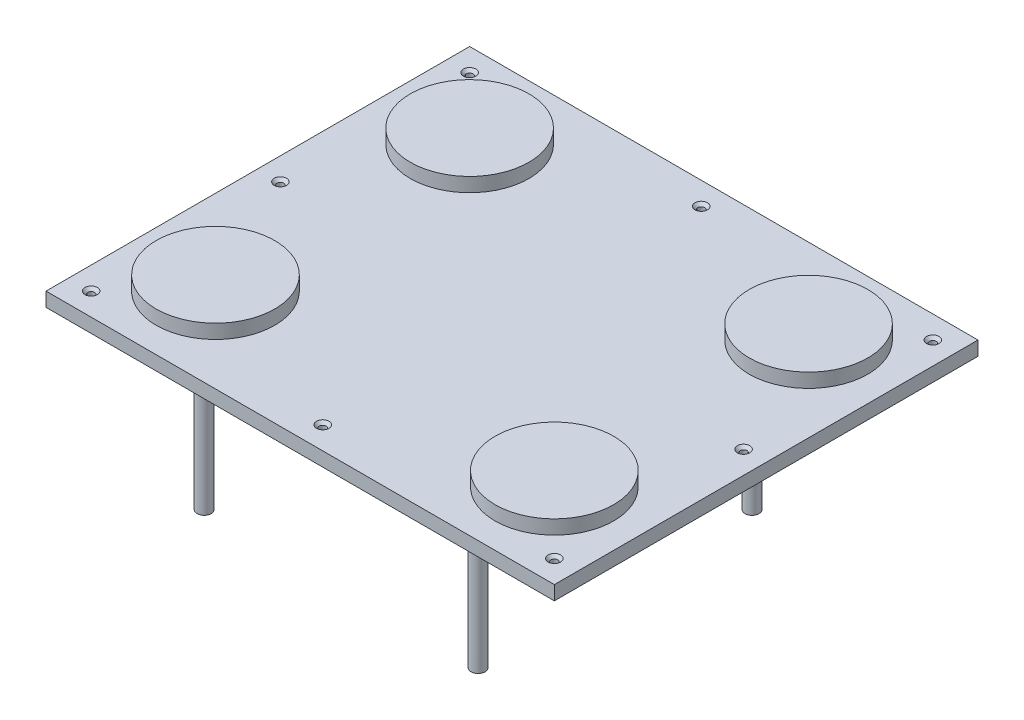
ISO-10303-21;
HEADER;
FILE_DESCRIPTION(('STEP AP214'),'2;1');
FILE_NAME('part.step','',(''),(''),'','','');
FILE_SCHEMA(('AUTOMOTIVE_DESIGN { 1 0 10303 214 1 1 1 1 }'));
ENDSEC;
DATA;
#1=APPLICATION_CONTEXT('core data for automotive mechanical design processes');
#2=APPLICATION_PROTOCOL_DEFINITION('international standard','automotive_design',2000,#1);
#3=PRODUCT_CONTEXT('',#1,'mechanical');
#4=PRODUCT('Part','Part','',(#3));
#5=PRODUCT_RELATED_PRODUCT_CATEGORY('part','',(#4));
#6=PRODUCT_DEFINITION_FORMATION('','',#4);
#7=PRODUCT_DEFINITION_CONTEXT('part definition',#1,'design');
#8=PRODUCT_DEFINITION('design','',#6,#7);
#9=PRODUCT_DEFINITION_SHAPE('','',#8);
#10=(LENGTH_UNIT() NAMED_UNIT(*) SI_UNIT(.MILLI.,.METRE.));
#11=(NAMED_UNIT(*) PLANE_ANGLE_UNIT() SI_UNIT($,.RADIAN.));
#12=(NAMED_UNIT(*) SI_UNIT($,.STERADIAN.) SOLID_ANGLE_UNIT());
#13=UNCERTAINTY_MEASURE_WITH_UNIT(LENGTH_MEASURE(1.E-05),#10,'distance_accuracy_value','');
#14=(GEOMETRIC_REPRESENTATION_CONTEXT(3) GLOBAL_UNCERTAINTY_ASSIGNED_CONTEXT((#13)) GLOBAL_UNIT_ASSIGNED_CONTEXT((#10,
#11,#12)) REPRESENTATION_CONTEXT('',''));
#15=CARTESIAN_POINT('',(0.,0.,0.));
#16=DIRECTION('',(0.,0.,1.));
#17=DIRECTION('',(1.,0.,0.));
#18=AXIS2_PLACEMENT_3D('',#15,#16,#17);
#19=CARTESIAN_POINT('',(90.,5.,-75.));
#20=DIRECTION('',(-1.,0.,0.));
#21=DIRECTION('',(0.,0.,1.));
#22=AXIS2_PLACEMENT_3D('',#19,#20,#21);
#23=PLANE('',#22);
#24=DIRECTION('',(0.,0.,-1.));
#25=VECTOR('',#24,1.);
#26=CARTESIAN_POINT('',(90.,0.,-75.));
#27=LINE('',#26,#25);
#28=CARTESIAN_POINT('',(90.,0.,75.));
#29=VERTEX_POINT('',#28);
#30=CARTESIAN_POINT('',(90.,0.,-75.));
#31=VERTEX_POINT('',#30);
#32=EDGE_CURVE('E279',#29,#31,#27,.T.);
#33=ORIENTED_EDGE('',*,*,#32,.T.);
#34=DIRECTION('',(0.,-1.,0.));
#35=VECTOR('',#34,1.);
#36=CARTESIAN_POINT('',(90.,5.,-75.));
#37=LINE('',#36,#35);
#38=CARTESIAN_POINT('',(90.,5.,-75.));
#39=VERTEX_POINT('',#38);
#40=EDGE_CURVE('E309',#39,#31,#37,.T.);
#41=ORIENTED_EDGE('',*,*,#40,.F.);
#42=DIRECTION('',(0.,0.,-1.));
#43=VECTOR('',#42,1.);
#44=CARTESIAN_POINT('',(90.,5.,-75.));
#45=LINE('',#44,#43);
#46=CARTESIAN_POINT('',(90.,5.,75.));
#47=VERTEX_POINT('',#46);
#48=EDGE_CURVE('E280',#47,#39,#45,.T.);
#49=ORIENTED_EDGE('',*,*,#48,.F.);
#50=DIRECTION('',(0.,-1.,0.));
#51=VECTOR('',#50,1.);
#52=CARTESIAN_POINT('',(90.,5.,75.));
#53=LINE('',#52,#51);
#54=EDGE_CURVE('E290',#47,#29,#53,.T.);
#55=ORIENTED_EDGE('',*,*,#54,.T.);
#56=EDGE_LOOP('',(#33,#41,#49,#55));
#57=FACE_BOUND('',#56,.T.);
#58=ADVANCED_FACE('F38',(#57),#23,.F.);
#59=CARTESIAN_POINT('',(-90.,5.,-75.));
#60=DIRECTION('',(0.,0.,1.));
#61=DIRECTION('',(1.,0.,0.));
#62=AXIS2_PLACEMENT_3D('',#59,#60,#61);
#63=PLANE('',#62);
#64=DIRECTION('',(-1.,0.,0.));
#65=VECTOR('',#64,1.);
#66=CARTESIAN_POINT('',(-90.,0.,-75.));
#67=LINE('',#66,#65);
#68=CARTESIAN_POINT('',(-90.,0.,-75.));
#69=VERTEX_POINT('',#68);
#70=EDGE_CURVE('E294',#31,#69,#67,.T.);
#71=ORIENTED_EDGE('',*,*,#70,.T.);
#72=DIRECTION('',(0.,-1.,0.));
#73=VECTOR('',#72,1.);
#74=CARTESIAN_POINT('',(-90.,5.,-75.));
#75=LINE('',#74,#73);
#76=CARTESIAN_POINT('',(-90.,5.,-75.));
#77=VERTEX_POINT('',#76);
#78=EDGE_CURVE('E306',#77,#69,#75,.T.);
#79=ORIENTED_EDGE('',*,*,#78,.F.);
#80=DIRECTION('',(-1.,0.,0.));
#81=VECTOR('',#80,1.);
#82=CARTESIAN_POINT('',(-90.,5.,-75.));
#83=LINE('',#82,#81);
#84=EDGE_CURVE('E88',#39,#77,#83,.T.);
#85=ORIENTED_EDGE('',*,*,#84,.F.);
#86=ORIENTED_EDGE('',*,*,#40,.T.);
#87=EDGE_LOOP('',(#71,#79,#85,#86));
#88=FACE_BOUND('',#87,.T.);
#89=ADVANCED_FACE('F360',(#88),#63,.F.);
#90=CARTESIAN_POINT('',(-90.,5.,-75.));
#91=DIRECTION('',(1.,0.,0.));
#92=DIRECTION('',(0.,0.,-1.));
#93=AXIS2_PLACEMENT_3D('',#90,#91,#92);
#94=PLANE('',#93);
#95=DIRECTION('',(0.,0.,1.));
#96=VECTOR('',#95,1.);
#97=CARTESIAN_POINT('',(-90.,0.,-75.));
#98=LINE('',#97,#96);
#99=CARTESIAN_POINT('',(-90.,0.,75.));
#100=VERTEX_POINT('',#99);
#101=EDGE_CURVE('E74',#69,#100,#98,.T.);
#102=ORIENTED_EDGE('',*,*,#101,.T.);
#103=DIRECTION('',(0.,-1.,0.));
#104=VECTOR('',#103,1.);
#105=CARTESIAN_POINT('',(-90.,5.,75.));
#106=LINE('',#105,#104);
#107=CARTESIAN_POINT('',(-90.,5.,75.));
#108=VERTEX_POINT('',#107);
#109=EDGE_CURVE('E303',#108,#100,#106,.T.);
#110=ORIENTED_EDGE('',*,*,#109,.F.);
#111=DIRECTION('',(0.,0.,1.));
#112=VECTOR('',#111,1.);
#113=CARTESIAN_POINT('',(-90.,5.,-75.));
#114=LINE('',#113,#112);
#115=EDGE_CURVE('E285',#77,#108,#114,.T.);
#116=ORIENTED_EDGE('',*,*,#115,.F.);
#117=ORIENTED_EDGE('',*,*,#78,.T.);
#118=EDGE_LOOP('',(#102,#110,#116,#117));
#119=FACE_BOUND('',#118,.T.);
#120=ADVANCED_FACE('F359',(#119),#94,.F.);
#121=CARTESIAN_POINT('',(-90.,5.,75.));
#122=DIRECTION('',(0.,0.,-1.));
#123=DIRECTION('',(-1.,0.,0.));
#124=AXIS2_PLACEMENT_3D('',#121,#122,#123);
#125=PLANE('',#124);
#126=DIRECTION('',(1.,0.,0.));
#127=VECTOR('',#126,1.);
#128=CARTESIAN_POINT('',(-90.,0.,75.));
#129=LINE('',#128,#127);
#130=EDGE_CURVE('E80',#100,#29,#129,.T.);
#131=ORIENTED_EDGE('',*,*,#130,.T.);
#132=ORIENTED_EDGE('',*,*,#54,.F.);
#133=DIRECTION('',(1.,0.,0.));
#134=VECTOR('',#133,1.);
#135=CARTESIAN_POINT('',(-90.,5.,75.));
#136=LINE('',#135,#134);
#137=EDGE_CURVE('E56',#108,#47,#136,.T.);
#138=ORIENTED_EDGE('',*,*,#137,.F.);
#139=ORIENTED_EDGE('',*,*,#109,.T.);
#140=EDGE_LOOP('',(#131,#132,#138,#139));
#141=FACE_BOUND('',#140,.T.);
#142=ADVANCED_FACE('F357',(#141),#125,.F.);
#143=CARTESIAN_POINT('',(0.,5.,0.));
#144=DIRECTION('',(0.,1.,0.));
#145=DIRECTION('',(0.,0.,1.));
#146=AXIS2_PLACEMENT_3D('',#143,#144,#145);
#147=PLANE('',#146);
#148=CARTESIAN_POINT('',(37.,5.,49.));
#149=DIRECTION('',(0.,1.,0.));
#150=DIRECTION('',(0.,0.,1.));
#151=AXIS2_PLACEMENT_3D('',#148,#149,#150);
#152=CIRCLE('',#151,0.499999999999987);
#153=CARTESIAN_POINT('',(37.,5.,49.5));
#154=VERTEX_POINT('',#153);
#155=EDGE_CURVE('E41',#154,#154,#152,.T.);
#156=ORIENTED_EDGE('',*,*,#155,.F.);
#157=EDGE_LOOP('',(#156));
#158=FACE_BOUND('',#157,.T.);
#159=CARTESIAN_POINT('',(60.,5.,45.));
#160=DIRECTION('',(0.,1.,0.));
#161=DIRECTION('',(0.,0.,1.));
#162=AXIS2_PLACEMENT_3D('',#159,#160,#161);
#163=CIRCLE('',#162,21.);
#164=CARTESIAN_POINT('',(60.,5.,66.));
#165=VERTEX_POINT('',#164);
#166=EDGE_CURVE('E151',#165,#165,#163,.T.);
#167=ORIENTED_EDGE('',*,*,#166,.F.);
#168=EDGE_LOOP('',(#167));
#169=FACE_BOUND('',#168,.T.);
#170=CARTESIAN_POINT('',(60.,5.,-45.));
#171=DIRECTION('',(0.,1.,0.));
#172=DIRECTION('',(0.,0.,1.));
#173=AXIS2_PLACEMENT_3D('',#170,#171,#172);
#174=CIRCLE('',#173,21.);
#175=CARTESIAN_POINT('',(60.,5.,-24.));
#176=VERTEX_POINT('',#175);
#177=EDGE_CURVE('E156',#176,#176,#174,.T.);
#178=ORIENTED_EDGE('',*,*,#177,.F.);
#179=EDGE_LOOP('',(#178));
#180=FACE_BOUND('',#179,.T.);
#181=CARTESIAN_POINT('',(-60.,5.,-45.));
#182=DIRECTION('',(0.,1.,0.));
#183=DIRECTION('',(0.,0.,1.));
#184=AXIS2_PLACEMENT_3D('',#181,#182,#183);
#185=CIRCLE('',#184,21.);
#186=CARTESIAN_POINT('',(-60.,5.,-24.));
#187=VERTEX_POINT('',#186);
#188=EDGE_CURVE('E164',#187,#187,#185,.T.);
#189=ORIENTED_EDGE('',*,*,#188,.F.);
#190=EDGE_LOOP('',(#189));
#191=FACE_BOUND('',#190,.T.);
#192=CARTESIAN_POINT('',(-60.,5.,45.));
#193=DIRECTION('',(0.,1.,0.));
#194=DIRECTION('',(0.,0.,1.));
#195=AXIS2_PLACEMENT_3D('',#192,#193,#194);
#196=CIRCLE('',#195,21.);
#197=CARTESIAN_POINT('',(-60.,5.,66.));
#198=VERTEX_POINT('',#197);
#199=EDGE_CURVE('E172',#198,#198,#196,.T.);
#200=ORIENTED_EDGE('',*,*,#199,.F.);
#201=EDGE_LOOP('',(#200));
#202=FACE_BOUND('',#201,.T.);
#203=CARTESIAN_POINT('',(-82.,5.,-67.));
#204=DIRECTION('',(0.,1.,0.));
#205=DIRECTION('',(0.,0.,1.));
#206=AXIS2_PLACEMENT_3D('',#203,#204,#205);
#207=CIRCLE('',#206,2.20000000000001);
#208=CARTESIAN_POINT('',(-82.,5.,-64.8));
#209=VERTEX_POINT('',#208);
#210=EDGE_CURVE('E180',#209,#209,#207,.T.);
#211=ORIENTED_EDGE('',*,*,#210,.F.);
#212=EDGE_LOOP('',(#211));
#213=FACE_BOUND('',#212,.T.);
#214=CARTESIAN_POINT('',(-82.,5.,0.));
#215=DIRECTION('',(0.,1.,0.));
#216=DIRECTION('',(0.,0.,1.));
#217=AXIS2_PLACEMENT_3D('',#214,#215,#216);
#218=CIRCLE('',#217,2.20000000000001);
#219=CARTESIAN_POINT('',(-82.,5.,2.20000000000001));
#220=VERTEX_POINT('',#219);
#221=EDGE_CURVE('E195',#220,#220,#218,.T.);
#222=ORIENTED_EDGE('',*,*,#221,.F.);
#223=EDGE_LOOP('',(#222));
#224=FACE_BOUND('',#223,.T.);
#225=CARTESIAN_POINT('',(-82.,5.,67.));
#226=DIRECTION('',(0.,1.,0.));
#227=DIRECTION('',(0.,0.,1.));
#228=AXIS2_PLACEMENT_3D('',#225,#226,#227);
#229=CIRCLE('',#228,2.20000000000001);
#230=CARTESIAN_POINT('',(-82.,5.,69.2));
#231=VERTEX_POINT('',#230);
#232=EDGE_CURVE('E207',#231,#231,#229,.T.);
#233=ORIENTED_EDGE('',*,*,#232,.F.);
#234=EDGE_LOOP('',(#233));
#235=FACE_BOUND('',#234,.T.);
#236=CARTESIAN_POINT('',(0.,5.,67.));
#237=DIRECTION('',(0.,1.,0.));
#238=DIRECTION('',(0.,0.,1.));
#239=AXIS2_PLACEMENT_3D('',#236,#237,#238);
#240=CIRCLE('',#239,2.2);
#241=CARTESIAN_POINT('',(0.,5.,69.2));
#242=VERTEX_POINT('',#241);
#243=EDGE_CURVE('E219',#242,#242,#240,.T.);
#244=ORIENTED_EDGE('',*,*,#243,.F.);
#245=EDGE_LOOP('',(#244));
#246=FACE_BOUND('',#245,.T.);
#247=CARTESIAN_POINT('',(82.,5.,67.));
#248=DIRECTION('',(0.,1.,0.));
#249=DIRECTION('',(0.,0.,1.));
#250=AXIS2_PLACEMENT_3D('',#247,#248,#249);
#251=CIRCLE('',#250,2.20000000000001);
#252=CARTESIAN_POINT('',(82.,5.,69.2));
#253=VERTEX_POINT('',#252);
#254=EDGE_CURVE('E231',#253,#253,#251,.T.);
#255=ORIENTED_EDGE('',*,*,#254,.F.);
#256=EDGE_LOOP('',(#255));
#257=FACE_BOUND('',#256,.T.);
#258=CARTESIAN_POINT('',(82.,5.,0.));
#259=DIRECTION('',(0.,1.,0.));
#260=DIRECTION('',(0.,0.,1.));
#261=AXIS2_PLACEMENT_3D('',#258,#259,#260);
#262=CIRCLE('',#261,2.20000000000001);
#263=CARTESIAN_POINT('',(82.,5.,2.20000000000001));
#264=VERTEX_POINT('',#263);
#265=EDGE_CURVE('E243',#264,#264,#262,.T.);
#266=ORIENTED_EDGE('',*,*,#265,.F.);
#267=EDGE_LOOP('',(#266));
#268=FACE_BOUND('',#267,.T.);
#269=CARTESIAN_POINT('',(82.,5.,-67.));
#270=DIRECTION('',(0.,1.,0.));
#271=DIRECTION('',(0.,0.,1.));
#272=AXIS2_PLACEMENT_3D('',#269,#270,#271);
#273=CIRCLE('',#272,2.20000000000001);
#274=CARTESIAN_POINT('',(82.,5.,-64.8));
#275=VERTEX_POINT('',#274);
#276=EDGE_CURVE('E255',#275,#275,#273,.T.);
#277=ORIENTED_EDGE('',*,*,#276,.F.);
#278=EDGE_LOOP('',(#277));
#279=FACE_BOUND('',#278,.T.);
#280=CARTESIAN_POINT('',(0.,5.,-67.));
#281=DIRECTION('',(0.,1.,0.));
#282=DIRECTION('',(0.,0.,1.));
#283=AXIS2_PLACEMENT_3D('',#280,#281,#282);
#284=CIRCLE('',#283,2.2);
#285=CARTESIAN_POINT('',(0.,5.,-64.8));
#286=VERTEX_POINT('',#285);
#287=EDGE_CURVE('E267',#286,#286,#284,.T.);
#288=ORIENTED_EDGE('',*,*,#287,.F.);
#289=EDGE_LOOP('',(#288));
#290=FACE_BOUND('',#289,.T.);
#291=ORIENTED_EDGE('',*,*,#48,.T.);
#292=ORIENTED_EDGE('',*,*,#84,.T.);
#293=ORIENTED_EDGE('',*,*,#115,.T.);
#294=ORIENTED_EDGE('',*,*,#137,.T.);
#295=EDGE_LOOP('',(#291,#292,#293,#294));
#296=FACE_BOUND('',#295,.T.);
#297=ADVANCED_FACE('F330',(#158,#169,#180,#191,#202,#213,#224,#235,#246,#257,#268,#279,#290,
#296),#147,.T.);
#298=CARTESIAN_POINT('',(0.,0.,0.));
#299=DIRECTION('',(0.,1.,0.));
#300=DIRECTION('',(0.,0.,1.));
#301=AXIS2_PLACEMENT_3D('',#298,#299,#300);
#302=PLANE('',#301);
#303=CARTESIAN_POINT('',(37.,0.,49.));
#304=DIRECTION('',(0.,1.,0.));
#305=DIRECTION('',(0.,0.,1.));
#306=AXIS2_PLACEMENT_3D('',#303,#304,#305);
#307=CIRCLE('',#306,2.5);
#308=CARTESIAN_POINT('',(37.,0.,51.5));
#309=VERTEX_POINT('',#308);
#310=EDGE_CURVE('E11',#309,#309,#307,.F.);
#311=ORIENTED_EDGE('',*,*,#310,.F.);
#312=EDGE_LOOP('',(#311));
#313=FACE_BOUND('',#312,.T.);
#314=CARTESIAN_POINT('',(37.,0.,-48.));
#315=DIRECTION('',(0.,1.,0.));
#316=DIRECTION('',(0.,0.,1.));
#317=AXIS2_PLACEMENT_3D('',#314,#315,#316);
#318=CIRCLE('',#317,2.5);
#319=CARTESIAN_POINT('',(37.,0.,-45.5));
#320=VERTEX_POINT('',#319);
#321=EDGE_CURVE('E48',#320,#320,#318,.F.);
#322=ORIENTED_EDGE('',*,*,#321,.F.);
#323=EDGE_LOOP('',(#322));
#324=FACE_BOUND('',#323,.T.);
#325=CARTESIAN_POINT('',(-60.,0.,49.));
#326=DIRECTION('',(0.,1.,0.));
#327=DIRECTION('',(0.,0.,1.));
#328=AXIS2_PLACEMENT_3D('',#325,#326,#327);
#329=CIRCLE('',#328,2.5);
#330=CARTESIAN_POINT('',(-60.,0.,51.5));
#331=VERTEX_POINT('',#330);
#332=EDGE_CURVE('E316',#331,#331,#329,.F.);
#333=ORIENTED_EDGE('',*,*,#332,.F.);
#334=EDGE_LOOP('',(#333));
#335=FACE_BOUND('',#334,.T.);
#336=CARTESIAN_POINT('',(-60.,0.,-48.));
#337=DIRECTION('',(0.,1.,0.));
#338=DIRECTION('',(0.,0.,1.));
#339=AXIS2_PLACEMENT_3D('',#336,#337,#338);
#340=CIRCLE('',#339,2.5);
#341=CARTESIAN_POINT('',(-60.,0.,-45.5));
#342=VERTEX_POINT('',#341);
#343=EDGE_CURVE('E312',#342,#342,#340,.F.);
#344=ORIENTED_EDGE('',*,*,#343,.F.);
#345=EDGE_LOOP('',(#344));
#346=FACE_BOUND('',#345,.T.);
#347=CARTESIAN_POINT('',(-82.,0.,-67.));
#348=DIRECTION('',(0.,1.,0.));
#349=DIRECTION('',(0.,0.,1.));
#350=AXIS2_PLACEMENT_3D('',#347,#348,#349);
#351=CIRCLE('',#350,1.19999999999999);
#352=CARTESIAN_POINT('',(-82.,0.,-65.8));
#353=VERTEX_POINT('',#352);
#354=EDGE_CURVE('E191',#353,#353,#351,.T.);
#355=ORIENTED_EDGE('',*,*,#354,.T.);
#356=EDGE_LOOP('',(#355));
#357=FACE_BOUND('',#356,.T.);
#358=CARTESIAN_POINT('',(-82.,0.,0.));
#359=DIRECTION('',(0.,1.,0.));
#360=DIRECTION('',(0.,0.,1.));
#361=AXIS2_PLACEMENT_3D('',#358,#359,#360);
#362=CIRCLE('',#361,1.19999999999999);
#363=CARTESIAN_POINT('',(-82.,0.,1.19999999999999));
#364=VERTEX_POINT('',#363);
#365=EDGE_CURVE('E203',#364,#364,#362,.T.);
#366=ORIENTED_EDGE('',*,*,#365,.T.);
#367=EDGE_LOOP('',(#366));
#368=FACE_BOUND('',#367,.T.);
#369=CARTESIAN_POINT('',(-82.,0.,67.));
#370=DIRECTION('',(0.,1.,0.));
#371=DIRECTION('',(0.,0.,1.));
#372=AXIS2_PLACEMENT_3D('',#369,#370,#371);
#373=CIRCLE('',#372,1.19999999999999);
#374=CARTESIAN_POINT('',(-82.,0.,68.2));
#375=VERTEX_POINT('',#374);
#376=EDGE_CURVE('E215',#375,#375,#373,.T.);
#377=ORIENTED_EDGE('',*,*,#376,.T.);
#378=EDGE_LOOP('',(#377));
#379=FACE_BOUND('',#378,.T.);
#380=CARTESIAN_POINT('',(0.,0.,67.));
#381=DIRECTION('',(0.,1.,0.));
#382=DIRECTION('',(0.,0.,1.));
#383=AXIS2_PLACEMENT_3D('',#380,#381,#382);
#384=CIRCLE('',#383,1.2);
#385=CARTESIAN_POINT('',(0.,0.,68.2));
#386=VERTEX_POINT('',#385);
#387=EDGE_CURVE('E227',#386,#386,#384,.T.);
#388=ORIENTED_EDGE('',*,*,#387,.T.);
#389=EDGE_LOOP('',(#388));
#390=FACE_BOUND('',#389,.T.);
#391=CARTESIAN_POINT('',(82.,0.,67.));
#392=DIRECTION('',(0.,1.,0.));
#393=DIRECTION('',(0.,0.,1.));
#394=AXIS2_PLACEMENT_3D('',#391,#392,#393);
#395=CIRCLE('',#394,1.19999999999999);
#396=CARTESIAN_POINT('',(82.,0.,68.2));
#397=VERTEX_POINT('',#396);
#398=EDGE_CURVE('E239',#397,#397,#395,.T.);
#399=ORIENTED_EDGE('',*,*,#398,.T.);
#400=EDGE_LOOP('',(#399));
#401=FACE_BOUND('',#400,.T.);
#402=CARTESIAN_POINT('',(82.,0.,0.));
#403=DIRECTION('',(0.,1.,0.));
#404=DIRECTION('',(0.,0.,1.));
#405=AXIS2_PLACEMENT_3D('',#402,#403,#404);
#406=CIRCLE('',#405,1.19999999999999);
#407=CARTESIAN_POINT('',(82.,0.,1.19999999999999));
#408=VERTEX_POINT('',#407);
#409=EDGE_CURVE('E251',#408,#408,#406,.T.);
#410=ORIENTED_EDGE('',*,*,#409,.T.);
#411=EDGE_LOOP('',(#410));
#412=FACE_BOUND('',#411,.T.);
#413=CARTESIAN_POINT('',(82.,0.,-67.));
#414=DIRECTION('',(0.,1.,0.));
#415=DIRECTION('',(0.,0.,1.));
#416=AXIS2_PLACEMENT_3D('',#413,#414,#415);
#417=CIRCLE('',#416,1.19999999999999);
#418=CARTESIAN_POINT('',(82.,0.,-65.8));
#419=VERTEX_POINT('',#418);
#420=EDGE_CURVE('E263',#419,#419,#417,.T.);
#421=ORIENTED_EDGE('',*,*,#420,.T.);
#422=EDGE_LOOP('',(#421));
#423=FACE_BOUND('',#422,.T.);
#424=CARTESIAN_POINT('',(0.,0.,-67.));
#425=DIRECTION('',(0.,1.,0.));
#426=DIRECTION('',(0.,0.,1.));
#427=AXIS2_PLACEMENT_3D('',#424,#425,#426);
#428=CIRCLE('',#427,1.2);
#429=CARTESIAN_POINT('',(0.,0.,-65.8));
#430=VERTEX_POINT('',#429);
#431=EDGE_CURVE('E275',#430,#430,#428,.T.);
#432=ORIENTED_EDGE('',*,*,#431,.T.);
#433=EDGE_LOOP('',(#432));
#434=FACE_BOUND('',#433,.T.);
#435=ORIENTED_EDGE('',*,*,#32,.F.);
#436=ORIENTED_EDGE('',*,*,#130,.F.);
#437=ORIENTED_EDGE('',*,*,#101,.F.);
#438=ORIENTED_EDGE('',*,*,#70,.F.);
#439=EDGE_LOOP('',(#435,#436,#437,#438));
#440=FACE_BOUND('',#439,.T.);
#441=ADVANCED_FACE('F326',(#313,#324,#335,#346,#357,#368,#379,#390,#401,#412,#423,#434,#440),
#302,.F.);
#442=CARTESIAN_POINT('',(0.,5.,-67.));
#443=DIRECTION('',(0.,1.,0.));
#444=DIRECTION('',(0.,0.,1.));
#445=AXIS2_PLACEMENT_3D('',#442,#443,#444);
#446=CYLINDRICAL_SURFACE('',#445,1.2);
#447=ORIENTED_EDGE('',*,*,#431,.F.);
#448=EDGE_LOOP('',(#447));
#449=FACE_BOUND('',#448,.T.);
#450=CARTESIAN_POINT('',(0.,4.,-67.));
#451=DIRECTION('',(0.,1.,0.));
#452=DIRECTION('',(0.,0.,1.));
#453=AXIS2_PLACEMENT_3D('',#450,#451,#452);
#454=CIRCLE('',#453,1.2);
#455=CARTESIAN_POINT('',(0.,4.,-65.8));
#456=VERTEX_POINT('',#455);
#457=EDGE_CURVE('E271',#456,#456,#454,.T.);
#458=ORIENTED_EDGE('',*,*,#457,.T.);
#459=EDGE_LOOP('',(#458));
#460=FACE_BOUND('',#459,.T.);
#461=ADVANCED_FACE('F329',(#449,#460),#446,.F.);
#462=CARTESIAN_POINT('',(0.,5.,-67.));
#463=DIRECTION('',(0.,1.,0.));
#464=DIRECTION('',(0.,0.,1.));
#465=AXIS2_PLACEMENT_3D('',#462,#463,#464);
#466=CONICAL_SURFACE('',#465,2.2,0.785398163397447);
#467=ORIENTED_EDGE('',*,*,#457,.F.);
#468=EDGE_LOOP('',(#467));
#469=FACE_BOUND('',#468,.T.);
#470=ORIENTED_EDGE('',*,*,#287,.T.);
#471=EDGE_LOOP('',(#470));
#472=FACE_BOUND('',#471,.T.);
#473=ADVANCED_FACE('F375',(#469,#472),#466,.F.);
#474=CARTESIAN_POINT('',(82.,5.,-67.));
#475=DIRECTION('',(0.,1.,0.));
#476=DIRECTION('',(0.,0.,1.));
#477=AXIS2_PLACEMENT_3D('',#474,#475,#476);
#478=CYLINDRICAL_SURFACE('',#477,1.19999999999999);
#479=ORIENTED_EDGE('',*,*,#420,.F.);
#480=EDGE_LOOP('',(#479));
#481=FACE_BOUND('',#480,.T.);
#482=CARTESIAN_POINT('',(82.,4.,-67.));
#483=DIRECTION('',(0.,1.,0.));
#484=DIRECTION('',(0.,0.,1.));
#485=AXIS2_PLACEMENT_3D('',#482,#483,#484);
#486=CIRCLE('',#485,1.19999999999999);
#487=CARTESIAN_POINT('',(82.,4.,-65.8));
#488=VERTEX_POINT('',#487);
#489=EDGE_CURVE('E259',#488,#488,#486,.T.);
#490=ORIENTED_EDGE('',*,*,#489,.T.);
#491=EDGE_LOOP('',(#490));
#492=FACE_BOUND('',#491,.T.);
#493=ADVANCED_FACE('F379',(#481,#492),#478,.F.);
#494=CARTESIAN_POINT('',(82.,5.,-67.));
#495=DIRECTION('',(0.,1.,0.));
#496=DIRECTION('',(0.,0.,1.));
#497=AXIS2_PLACEMENT_3D('',#494,#495,#496);
#498=CONICAL_SURFACE('',#497,2.20000000000001,0.785398163397453);
#499=ORIENTED_EDGE('',*,*,#489,.F.);
#500=EDGE_LOOP('',(#499));
#501=FACE_BOUND('',#500,.T.);
#502=ORIENTED_EDGE('',*,*,#276,.T.);
#503=EDGE_LOOP('',(#502));
#504=FACE_BOUND('',#503,.T.);
#505=ADVANCED_FACE('F383',(#501,#504),#498,.F.);
#506=CARTESIAN_POINT('',(82.,5.,0.));
#507=DIRECTION('',(0.,1.,0.));
#508=DIRECTION('',(0.,0.,1.));
#509=AXIS2_PLACEMENT_3D('',#506,#507,#508);
#510=CYLINDRICAL_SURFACE('',#509,1.19999999999999);
#511=ORIENTED_EDGE('',*,*,#409,.F.);
#512=EDGE_LOOP('',(#511));
#513=FACE_BOUND('',#512,.T.);
#514=CARTESIAN_POINT('',(82.,4.,0.));
#515=DIRECTION('',(0.,1.,0.));
#516=DIRECTION('',(0.,0.,1.));
#517=AXIS2_PLACEMENT_3D('',#514,#515,#516);
#518=CIRCLE('',#517,1.19999999999999);
#519=CARTESIAN_POINT('',(82.,4.,1.19999999999999));
#520=VERTEX_POINT('',#519);
#521=EDGE_CURVE('E247',#520,#520,#518,.T.);
#522=ORIENTED_EDGE('',*,*,#521,.T.);
#523=EDGE_LOOP('',(#522));
#524=FACE_BOUND('',#523,.T.);
#525=ADVANCED_FACE('F387',(#513,#524),#510,.F.);
#526=CARTESIAN_POINT('',(82.,5.,0.));
#527=DIRECTION('',(0.,1.,0.));
#528=DIRECTION('',(0.,0.,1.));
#529=AXIS2_PLACEMENT_3D('',#526,#527,#528);
#530=CONICAL_SURFACE('',#529,2.20000000000001,0.785398163397453);
#531=ORIENTED_EDGE('',*,*,#521,.F.);
#532=EDGE_LOOP('',(#531));
#533=FACE_BOUND('',#532,.T.);
#534=ORIENTED_EDGE('',*,*,#265,.T.);
#535=EDGE_LOOP('',(#534));
#536=FACE_BOUND('',#535,.T.);
#537=ADVANCED_FACE('F391',(#533,#536),#530,.F.);
#538=CARTESIAN_POINT('',(82.,5.,67.));
#539=DIRECTION('',(0.,1.,0.));
#540=DIRECTION('',(0.,0.,1.));
#541=AXIS2_PLACEMENT_3D('',#538,#539,#540);
#542=CYLINDRICAL_SURFACE('',#541,1.19999999999999);
#543=ORIENTED_EDGE('',*,*,#398,.F.);
#544=EDGE_LOOP('',(#543));
#545=FACE_BOUND('',#544,.T.);
#546=CARTESIAN_POINT('',(82.,4.,67.));
#547=DIRECTION('',(0.,1.,0.));
#548=DIRECTION('',(0.,0.,1.));
#549=AXIS2_PLACEMENT_3D('',#546,#547,#548);
#550=CIRCLE('',#549,1.19999999999999);
#551=CARTESIAN_POINT('',(82.,4.,68.2));
#552=VERTEX_POINT('',#551);
#553=EDGE_CURVE('E235',#552,#552,#550,.T.);
#554=ORIENTED_EDGE('',*,*,#553,.T.);
#555=EDGE_LOOP('',(#554));
#556=FACE_BOUND('',#555,.T.);
#557=ADVANCED_FACE('F395',(#545,#556),#542,.F.);
#558=CARTESIAN_POINT('',(82.,5.,67.));
#559=DIRECTION('',(0.,1.,0.));
#560=DIRECTION('',(0.,0.,1.));
#561=AXIS2_PLACEMENT_3D('',#558,#559,#560);
#562=CONICAL_SURFACE('',#561,2.20000000000001,0.785398163397453);
#563=ORIENTED_EDGE('',*,*,#553,.F.);
#564=EDGE_LOOP('',(#563));
#565=FACE_BOUND('',#564,.T.);
#566=ORIENTED_EDGE('',*,*,#254,.T.);
#567=EDGE_LOOP('',(#566));
#568=FACE_BOUND('',#567,.T.);
#569=ADVANCED_FACE('F399',(#565,#568),#562,.F.);
#570=CARTESIAN_POINT('',(0.,5.,67.));
#571=DIRECTION('',(0.,1.,0.));
#572=DIRECTION('',(0.,0.,1.));
#573=AXIS2_PLACEMENT_3D('',#570,#571,#572);
#574=CYLINDRICAL_SURFACE('',#573,1.2);
#575=ORIENTED_EDGE('',*,*,#387,.F.);
#576=EDGE_LOOP('',(#575));
#577=FACE_BOUND('',#576,.T.);
#578=CARTESIAN_POINT('',(0.,4.,67.));
#579=DIRECTION('',(0.,1.,0.));
#580=DIRECTION('',(0.,0.,1.));
#581=AXIS2_PLACEMENT_3D('',#578,#579,#580);
#582=CIRCLE('',#581,1.2);
#583=CARTESIAN_POINT('',(0.,4.,68.2));
#584=VERTEX_POINT('',#583);
#585=EDGE_CURVE('E223',#584,#584,#582,.T.);
#586=ORIENTED_EDGE('',*,*,#585,.T.);
#587=EDGE_LOOP('',(#586));
#588=FACE_BOUND('',#587,.T.);
#589=ADVANCED_FACE('F403',(#577,#588),#574,.F.);
#590=CARTESIAN_POINT('',(0.,5.,67.));
#591=DIRECTION('',(0.,1.,0.));
#592=DIRECTION('',(0.,0.,1.));
#593=AXIS2_PLACEMENT_3D('',#590,#591,#592);
#594=CONICAL_SURFACE('',#593,2.2,0.785398163397447);
#595=ORIENTED_EDGE('',*,*,#585,.F.);
#596=EDGE_LOOP('',(#595));
#597=FACE_BOUND('',#596,.T.);
#598=ORIENTED_EDGE('',*,*,#243,.T.);
#599=EDGE_LOOP('',(#598));
#600=FACE_BOUND('',#599,.T.);
#601=ADVANCED_FACE('F407',(#597,#600),#594,.F.);
#602=CARTESIAN_POINT('',(-82.,5.,67.));
#603=DIRECTION('',(0.,1.,0.));
#604=DIRECTION('',(0.,0.,1.));
#605=AXIS2_PLACEMENT_3D('',#602,#603,#604);
#606=CYLINDRICAL_SURFACE('',#605,1.19999999999999);
#607=ORIENTED_EDGE('',*,*,#376,.F.);
#608=EDGE_LOOP('',(#607));
#609=FACE_BOUND('',#608,.T.);
#610=CARTESIAN_POINT('',(-82.,4.,67.));
#611=DIRECTION('',(0.,1.,0.));
#612=DIRECTION('',(0.,0.,1.));
#613=AXIS2_PLACEMENT_3D('',#610,#611,#612);
#614=CIRCLE('',#613,1.19999999999999);
#615=CARTESIAN_POINT('',(-82.,4.,68.2));
#616=VERTEX_POINT('',#615);
#617=EDGE_CURVE('E211',#616,#616,#614,.T.);
#618=ORIENTED_EDGE('',*,*,#617,.T.);
#619=EDGE_LOOP('',(#618));
#620=FACE_BOUND('',#619,.T.);
#621=ADVANCED_FACE('F411',(#609,#620),#606,.F.);
#622=CARTESIAN_POINT('',(-82.,5.,67.));
#623=DIRECTION('',(0.,1.,0.));
#624=DIRECTION('',(0.,0.,1.));
#625=AXIS2_PLACEMENT_3D('',#622,#623,#624);
#626=CONICAL_SURFACE('',#625,2.20000000000001,0.785398163397453);
#627=ORIENTED_EDGE('',*,*,#617,.F.);
#628=EDGE_LOOP('',(#627));
#629=FACE_BOUND('',#628,.T.);
#630=ORIENTED_EDGE('',*,*,#232,.T.);
#631=EDGE_LOOP('',(#630));
#632=FACE_BOUND('',#631,.T.);
#633=ADVANCED_FACE('F415',(#629,#632),#626,.F.);
#634=CARTESIAN_POINT('',(-82.,5.,0.));
#635=DIRECTION('',(0.,1.,0.));
#636=DIRECTION('',(0.,0.,1.));
#637=AXIS2_PLACEMENT_3D('',#634,#635,#636);
#638=CYLINDRICAL_SURFACE('',#637,1.19999999999999);
#639=ORIENTED_EDGE('',*,*,#365,.F.);
#640=EDGE_LOOP('',(#639));
#641=FACE_BOUND('',#640,.T.);
#642=CARTESIAN_POINT('',(-82.,4.,0.));
#643=DIRECTION('',(0.,1.,0.));
#644=DIRECTION('',(0.,0.,1.));
#645=AXIS2_PLACEMENT_3D('',#642,#643,#644);
#646=CIRCLE('',#645,1.19999999999999);
#647=CARTESIAN_POINT('',(-82.,4.,1.19999999999999));
#648=VERTEX_POINT('',#647);
#649=EDGE_CURVE('E199',#648,#648,#646,.T.);
#650=ORIENTED_EDGE('',*,*,#649,.T.);
#651=EDGE_LOOP('',(#650));
#652=FACE_BOUND('',#651,.T.);
#653=ADVANCED_FACE('F419',(#641,#652),#638,.F.);
#654=CARTESIAN_POINT('',(-82.,5.,0.));
#655=DIRECTION('',(0.,1.,0.));
#656=DIRECTION('',(0.,0.,1.));
#657=AXIS2_PLACEMENT_3D('',#654,#655,#656);
#658=CONICAL_SURFACE('',#657,2.20000000000001,0.785398163397453);
#659=ORIENTED_EDGE('',*,*,#649,.F.);
#660=EDGE_LOOP('',(#659));
#661=FACE_BOUND('',#660,.T.);
#662=ORIENTED_EDGE('',*,*,#221,.T.);
#663=EDGE_LOOP('',(#662));
#664=FACE_BOUND('',#663,.T.);
#665=ADVANCED_FACE('F423',(#661,#664),#658,.F.);
#666=CARTESIAN_POINT('',(-82.,5.,-67.));
#667=DIRECTION('',(0.,1.,0.));
#668=DIRECTION('',(0.,0.,1.));
#669=AXIS2_PLACEMENT_3D('',#666,#667,#668);
#670=CYLINDRICAL_SURFACE('',#669,1.19999999999999);
#671=ORIENTED_EDGE('',*,*,#354,.F.);
#672=EDGE_LOOP('',(#671));
#673=FACE_BOUND('',#672,.T.);
#674=CARTESIAN_POINT('',(-82.,4.,-67.));
#675=DIRECTION('',(0.,1.,0.));
#676=DIRECTION('',(0.,0.,1.));
#677=AXIS2_PLACEMENT_3D('',#674,#675,#676);
#678=CIRCLE('',#677,1.19999999999999);
#679=CARTESIAN_POINT('',(-82.,4.,-65.8));
#680=VERTEX_POINT('',#679);
#681=EDGE_CURVE('E187',#680,#680,#678,.T.);
#682=ORIENTED_EDGE('',*,*,#681,.T.);
#683=EDGE_LOOP('',(#682));
#684=FACE_BOUND('',#683,.T.);
#685=ADVANCED_FACE('F427',(#673,#684),#670,.F.);
#686=CARTESIAN_POINT('',(-82.,5.,-67.));
#687=DIRECTION('',(0.,1.,0.));
#688=DIRECTION('',(0.,0.,1.));
#689=AXIS2_PLACEMENT_3D('',#686,#687,#688);
#690=CONICAL_SURFACE('',#689,2.20000000000001,0.785398163397453);
#691=ORIENTED_EDGE('',*,*,#681,.F.);
#692=EDGE_LOOP('',(#691));
#693=FACE_BOUND('',#692,.T.);
#694=ORIENTED_EDGE('',*,*,#210,.T.);
#695=EDGE_LOOP('',(#694));
#696=FACE_BOUND('',#695,.T.);
#697=ADVANCED_FACE('F431',(#693,#696),#690,.F.);
#698=CARTESIAN_POINT('',(-60.,10.,45.));
#699=DIRECTION('',(0.,-1.,0.));
#700=DIRECTION('',(0.,0.,-1.));
#701=AXIS2_PLACEMENT_3D('',#698,#699,#700);
#702=CYLINDRICAL_SURFACE('',#701,21.);
#703=CARTESIAN_POINT('',(-60.,10.,45.));
#704=DIRECTION('',(0.,1.,0.));
#705=DIRECTION('',(0.,0.,1.));
#706=AXIS2_PLACEMENT_3D('',#703,#704,#705);
#707=CIRCLE('',#706,21.);
#708=CARTESIAN_POINT('',(-60.,10.,66.));
#709=VERTEX_POINT('',#708);
#710=EDGE_CURVE('E176',#709,#709,#707,.T.);
#711=ORIENTED_EDGE('',*,*,#710,.F.);
#712=EDGE_LOOP('',(#711));
#713=FACE_BOUND('',#712,.T.);
#714=ORIENTED_EDGE('',*,*,#199,.T.);
#715=EDGE_LOOP('',(#714));
#716=FACE_BOUND('',#715,.T.);
#717=ADVANCED_FACE('F435',(#713,#716),#702,.T.);
#718=CARTESIAN_POINT('',(-60.,10.,45.));
#719=DIRECTION('',(0.,1.,0.));
#720=DIRECTION('',(0.,0.,1.));
#721=AXIS2_PLACEMENT_3D('',#718,#719,#720);
#722=PLANE('',#721);
#723=ORIENTED_EDGE('',*,*,#710,.T.);
#724=EDGE_LOOP('',(#723));
#725=FACE_BOUND('',#724,.T.);
#726=ADVANCED_FACE('F439',(#725),#722,.T.);
#727=CARTESIAN_POINT('',(-60.,10.,-45.));
#728=DIRECTION('',(0.,-1.,0.));
#729=DIRECTION('',(0.,0.,-1.));
#730=AXIS2_PLACEMENT_3D('',#727,#728,#729);
#731=CYLINDRICAL_SURFACE('',#730,21.);
#732=CARTESIAN_POINT('',(-60.,10.,-45.));
#733=DIRECTION('',(0.,1.,0.));
#734=DIRECTION('',(0.,0.,1.));
#735=AXIS2_PLACEMENT_3D('',#732,#733,#734);
#736=CIRCLE('',#735,21.);
#737=CARTESIAN_POINT('',(-60.,10.,-24.));
#738=VERTEX_POINT('',#737);
#739=EDGE_CURVE('E168',#738,#738,#736,.T.);
#740=ORIENTED_EDGE('',*,*,#739,.F.);
#741=EDGE_LOOP('',(#740));
#742=FACE_BOUND('',#741,.T.);
#743=ORIENTED_EDGE('',*,*,#188,.T.);
#744=EDGE_LOOP('',(#743));
#745=FACE_BOUND('',#744,.T.);
#746=ADVANCED_FACE('F443',(#742,#745),#731,.T.);
#747=CARTESIAN_POINT('',(-60.,10.,-45.));
#748=DIRECTION('',(0.,1.,0.));
#749=DIRECTION('',(0.,0.,1.));
#750=AXIS2_PLACEMENT_3D('',#747,#748,#749);
#751=PLANE('',#750);
#752=ORIENTED_EDGE('',*,*,#739,.T.);
#753=EDGE_LOOP('',(#752));
#754=FACE_BOUND('',#753,.T.);
#755=ADVANCED_FACE('F447',(#754),#751,.T.);
#756=CARTESIAN_POINT('',(60.,10.,-45.));
#757=DIRECTION('',(0.,-1.,0.));
#758=DIRECTION('',(0.,0.,-1.));
#759=AXIS2_PLACEMENT_3D('',#756,#757,#758);
#760=CYLINDRICAL_SURFACE('',#759,21.);
#761=CARTESIAN_POINT('',(60.,10.,-45.));
#762=DIRECTION('',(0.,1.,0.));
#763=DIRECTION('',(0.,0.,1.));
#764=AXIS2_PLACEMENT_3D('',#761,#762,#763);
#765=CIRCLE('',#764,21.);
#766=CARTESIAN_POINT('',(60.,10.,-24.));
#767=VERTEX_POINT('',#766);
#768=EDGE_CURVE('E160',#767,#767,#765,.T.);
#769=ORIENTED_EDGE('',*,*,#768,.F.);
#770=EDGE_LOOP('',(#769));
#771=FACE_BOUND('',#770,.T.);
#772=ORIENTED_EDGE('',*,*,#177,.T.);
#773=EDGE_LOOP('',(#772));
#774=FACE_BOUND('',#773,.T.);
#775=ADVANCED_FACE('F451',(#771,#774),#760,.T.);
#776=CARTESIAN_POINT('',(60.,10.,-45.));
#777=DIRECTION('',(0.,1.,0.));
#778=DIRECTION('',(0.,0.,1.));
#779=AXIS2_PLACEMENT_3D('',#776,#777,#778);
#780=PLANE('',#779);
#781=ORIENTED_EDGE('',*,*,#768,.T.);
#782=EDGE_LOOP('',(#781));
#783=FACE_BOUND('',#782,.T.);
#784=ADVANCED_FACE('F455',(#783),#780,.T.);
#785=CARTESIAN_POINT('',(60.,10.,45.));
#786=DIRECTION('',(0.,-1.,0.));
#787=DIRECTION('',(0.,0.,-1.));
#788=AXIS2_PLACEMENT_3D('',#785,#786,#787);
#789=CYLINDRICAL_SURFACE('',#788,21.);
#790=CARTESIAN_POINT('',(60.,10.,45.));
#791=DIRECTION('',(0.,1.,0.));
#792=DIRECTION('',(0.,0.,1.));
#793=AXIS2_PLACEMENT_3D('',#790,#791,#792);
#794=CIRCLE('',#793,21.);
#795=CARTESIAN_POINT('',(60.,10.,66.));
#796=VERTEX_POINT('',#795);
#797=EDGE_CURVE('E152',#796,#796,#794,.T.);
#798=ORIENTED_EDGE('',*,*,#797,.F.);
#799=EDGE_LOOP('',(#798));
#800=FACE_BOUND('',#799,.T.);
#801=ORIENTED_EDGE('',*,*,#166,.T.);
#802=EDGE_LOOP('',(#801));
#803=FACE_BOUND('',#802,.T.);
#804=ADVANCED_FACE('F459',(#800,#803),#789,.T.);
#805=CARTESIAN_POINT('',(60.,10.,45.));
#806=DIRECTION('',(0.,1.,0.));
#807=DIRECTION('',(0.,0.,1.));
#808=AXIS2_PLACEMENT_3D('',#805,#806,#807);
#809=PLANE('',#808);
#810=ORIENTED_EDGE('',*,*,#797,.T.);
#811=EDGE_LOOP('',(#810));
#812=FACE_BOUND('',#811,.T.);
#813=ADVANCED_FACE('F463',(#812),#809,.T.);
#814=CARTESIAN_POINT('',(-60.,-60.,-48.));
#815=DIRECTION('',(0.,1.,0.));
#816=DIRECTION('',(0.,0.,1.));
#817=AXIS2_PLACEMENT_3D('',#814,#815,#816);
#818=CYLINDRICAL_SURFACE('',#817,2.5);
#819=CARTESIAN_POINT('',(-60.,-60.,-48.));
#820=DIRECTION('',(0.,-1.,0.));
#821=DIRECTION('',(0.,0.,-1.));
#822=AXIS2_PLACEMENT_3D('',#819,#820,#821);
#823=CIRCLE('',#822,2.5);
#824=CARTESIAN_POINT('',(-60.,-60.,-50.5));
#825=VERTEX_POINT('',#824);
#826=EDGE_CURVE('E147',#825,#825,#823,.T.);
#827=ORIENTED_EDGE('',*,*,#826,.F.);
#828=EDGE_LOOP('',(#827));
#829=FACE_BOUND('',#828,.T.);
#830=ORIENTED_EDGE('',*,*,#343,.T.);
#831=EDGE_LOOP('',(#830));
#832=FACE_BOUND('',#831,.T.);
#833=ADVANCED_FACE('F467',(#829,#832),#818,.T.);
#834=CARTESIAN_POINT('',(-60.,-60.,-48.));
#835=DIRECTION('',(0.,-1.,0.));
#836=DIRECTION('',(0.,0.,-1.));
#837=AXIS2_PLACEMENT_3D('',#834,#835,#836);
#838=PLANE('',#837);
#839=CARTESIAN_POINT('',(-60.,-60.,-48.));
#840=DIRECTION('',(0.,-1.,0.));
#841=DIRECTION('',(0.,0.,-1.));
#842=AXIS2_PLACEMENT_3D('',#839,#840,#841);
#843=CIRCLE('',#842,0.499999999999987);
#844=CARTESIAN_POINT('',(-60.,-60.,-48.5));
#845=VERTEX_POINT('',#844);
#846=EDGE_CURVE('E110',#845,#845,#843,.T.);
#847=ORIENTED_EDGE('',*,*,#846,.F.);
#848=EDGE_LOOP('',(#847));
#849=FACE_BOUND('',#848,.T.);
#850=ORIENTED_EDGE('',*,*,#826,.T.);
#851=EDGE_LOOP('',(#850));
#852=FACE_BOUND('',#851,.T.);
#853=ADVANCED_FACE('F471',(#849,#852),#838,.T.);
#854=CARTESIAN_POINT('',(-60.,-60.,49.));
#855=DIRECTION('',(0.,1.,0.));
#856=DIRECTION('',(0.,0.,1.));
#857=AXIS2_PLACEMENT_3D('',#854,#855,#856);
#858=CYLINDRICAL_SURFACE('',#857,2.5);
#859=CARTESIAN_POINT('',(-60.,-60.,49.));
#860=DIRECTION('',(0.,-1.,0.));
#861=DIRECTION('',(0.,0.,-1.));
#862=AXIS2_PLACEMENT_3D('',#859,#860,#861);
#863=CIRCLE('',#862,2.5);
#864=CARTESIAN_POINT('',(-60.,-60.,46.5));
#865=VERTEX_POINT('',#864);
#866=EDGE_CURVE('E143',#865,#865,#863,.T.);
#867=ORIENTED_EDGE('',*,*,#866,.F.);
#868=EDGE_LOOP('',(#867));
#869=FACE_BOUND('',#868,.T.);
#870=ORIENTED_EDGE('',*,*,#332,.T.);
#871=EDGE_LOOP('',(#870));
#872=FACE_BOUND('',#871,.T.);
#873=ADVANCED_FACE('F475',(#869,#872),#858,.T.);
#874=CARTESIAN_POINT('',(-60.,-60.,49.));
#875=DIRECTION('',(0.,-1.,0.));
#876=DIRECTION('',(0.,0.,-1.));
#877=AXIS2_PLACEMENT_3D('',#874,#875,#876);
#878=PLANE('',#877);
#879=CARTESIAN_POINT('',(-60.,-60.,49.));
#880=DIRECTION('',(0.,-1.,0.));
#881=DIRECTION('',(0.,0.,-1.));
#882=AXIS2_PLACEMENT_3D('',#879,#880,#881);
#883=CIRCLE('',#882,0.499999999999987);
#884=CARTESIAN_POINT('',(-60.,-60.,48.5));
#885=VERTEX_POINT('',#884);
#886=EDGE_CURVE('E109',#885,#885,#883,.T.);
#887=ORIENTED_EDGE('',*,*,#886,.F.);
#888=EDGE_LOOP('',(#887));
#889=FACE_BOUND('',#888,.T.);
#890=ORIENTED_EDGE('',*,*,#866,.T.);
#891=EDGE_LOOP('',(#890));
#892=FACE_BOUND('',#891,.T.);
#893=ADVANCED_FACE('F479',(#889,#892),#878,.T.);
#894=CARTESIAN_POINT('',(37.,-60.,-48.));
#895=DIRECTION('',(0.,1.,0.));
#896=DIRECTION('',(0.,0.,1.));
#897=AXIS2_PLACEMENT_3D('',#894,#895,#896);
#898=CYLINDRICAL_SURFACE('',#897,2.5);
#899=CARTESIAN_POINT('',(37.,-60.,-48.));
#900=DIRECTION('',(0.,-1.,0.));
#901=DIRECTION('',(0.,0.,-1.));
#902=AXIS2_PLACEMENT_3D('',#899,#900,#901);
#903=CIRCLE('',#902,2.5);
#904=CARTESIAN_POINT('',(37.,-60.,-50.5));
#905=VERTEX_POINT('',#904);
#906=EDGE_CURVE('E139',#905,#905,#903,.T.);
#907=ORIENTED_EDGE('',*,*,#906,.F.);
#908=EDGE_LOOP('',(#907));
#909=FACE_BOUND('',#908,.T.);
#910=ORIENTED_EDGE('',*,*,#321,.T.);
#911=EDGE_LOOP('',(#910));
#912=FACE_BOUND('',#911,.T.);
#913=ADVANCED_FACE('F324',(#909,#912),#898,.T.);
#914=CARTESIAN_POINT('',(37.,-60.,-48.));
#915=DIRECTION('',(0.,-1.,0.));
#916=DIRECTION('',(0.,0.,-1.));
#917=AXIS2_PLACEMENT_3D('',#914,#915,#916);
#918=PLANE('',#917);
#919=CARTESIAN_POINT('',(37.,-60.,-48.));
#920=DIRECTION('',(0.,-1.,0.));
#921=DIRECTION('',(0.,0.,-1.));
#922=AXIS2_PLACEMENT_3D('',#919,#920,#921);
#923=CIRCLE('',#922,0.499999999999987);
#924=CARTESIAN_POINT('',(37.,-60.,-48.5));
#925=VERTEX_POINT('',#924);
#926=EDGE_CURVE('E127',#925,#925,#923,.T.);
#927=ORIENTED_EDGE('',*,*,#926,.F.);
#928=EDGE_LOOP('',(#927));
#929=FACE_BOUND('',#928,.T.);
#930=ORIENTED_EDGE('',*,*,#906,.T.);
#931=EDGE_LOOP('',(#930));
#932=FACE_BOUND('',#931,.T.);
#933=ADVANCED_FACE('F486',(#929,#932),#918,.T.);
#934=CARTESIAN_POINT('',(37.,-60.,49.));
#935=DIRECTION('',(0.,1.,0.));
#936=DIRECTION('',(0.,0.,1.));
#937=AXIS2_PLACEMENT_3D('',#934,#935,#936);
#938=CYLINDRICAL_SURFACE('',#937,2.5);
#939=CARTESIAN_POINT('',(37.,-60.,49.));
#940=DIRECTION('',(0.,-1.,0.));
#941=DIRECTION('',(0.,0.,-1.));
#942=AXIS2_PLACEMENT_3D('',#939,#940,#941);
#943=CIRCLE('',#942,2.5);
#944=CARTESIAN_POINT('',(37.,-60.,46.5));
#945=VERTEX_POINT('',#944);
#946=EDGE_CURVE('E135',#945,#945,#943,.T.);
#947=ORIENTED_EDGE('',*,*,#946,.F.);
#948=EDGE_LOOP('',(#947));
#949=FACE_BOUND('',#948,.T.);
#950=ORIENTED_EDGE('',*,*,#310,.T.);
#951=EDGE_LOOP('',(#950));
#952=FACE_BOUND('',#951,.T.);
#953=ADVANCED_FACE('F490',(#949,#952),#938,.T.);
#954=CARTESIAN_POINT('',(37.,-60.,49.));
#955=DIRECTION('',(0.,-1.,0.));
#956=DIRECTION('',(0.,0.,-1.));
#957=AXIS2_PLACEMENT_3D('',#954,#955,#956);
#958=PLANE('',#957);
#959=ORIENTED_EDGE('',*,*,#946,.T.);
#960=EDGE_LOOP('',(#959));
#961=FACE_BOUND('',#960,.T.);
#962=ADVANCED_FACE('F494',(#961),#958,.T.);
#963=CARTESIAN_POINT('',(37.,-30.,-48.));
#964=DIRECTION('',(0.,-1.,0.));
#965=DIRECTION('',(0.,0.,-1.));
#966=AXIS2_PLACEMENT_3D('',#963,#964,#965);
#967=CONICAL_SURFACE('',#966,0.499999999999987,1.02974425867664);
#968=CARTESIAN_POINT('',(37.,-29.6995696904862,-48.));
#969=VERTEX_POINT('',#968);
#970=VERTEX_LOOP('',#969);
#971=FACE_BOUND('',#970,.T.);
#972=CARTESIAN_POINT('',(37.,-30.,-48.));
#973=DIRECTION('',(0.,-1.,0.));
#974=DIRECTION('',(0.,0.,-1.));
#975=AXIS2_PLACEMENT_3D('',#972,#973,#974);
#976=CIRCLE('',#975,0.499999999999987);
#977=CARTESIAN_POINT('',(37.,-30.,-48.5));
#978=VERTEX_POINT('',#977);
#979=EDGE_CURVE('E131',#978,#978,#976,.T.);
#980=ORIENTED_EDGE('',*,*,#979,.T.);
#981=EDGE_LOOP('',(#980));
#982=FACE_BOUND('',#981,.T.);
#983=ADVANCED_FACE('F498',(#971,#982),#967,.F.);
#984=CARTESIAN_POINT('',(37.,-60.,-48.));
#985=DIRECTION('',(0.,-1.,0.));
#986=DIRECTION('',(0.,0.,-1.));
#987=AXIS2_PLACEMENT_3D('',#984,#985,#986);
#988=CYLINDRICAL_SURFACE('',#987,0.499999999999987);
#989=ORIENTED_EDGE('',*,*,#979,.F.);
#990=EDGE_LOOP('',(#989));
#991=FACE_BOUND('',#990,.T.);
#992=ORIENTED_EDGE('',*,*,#926,.T.);
#993=EDGE_LOOP('',(#992));
#994=FACE_BOUND('',#993,.T.);
#995=ADVANCED_FACE('F502',(#991,#994),#988,.F.);
#996=CARTESIAN_POINT('',(37.5,0.,49.));
#997=DIRECTION('',(0.,-1.,0.));
#998=DIRECTION('',(0.,0.,-1.));
#999=AXIS2_PLACEMENT_3D('',#996,#997,#998);
#1000=PLANE('',#999);
#1001=CARTESIAN_POINT('',(37.,0.,49.));
#1002=DIRECTION('',(0.,-1.,0.));
#1003=DIRECTION('',(0.,0.,-1.));
#1004=AXIS2_PLACEMENT_3D('',#1001,#1002,#1003);
#1005=CIRCLE('',#1004,0.499999999999987);
#1006=CARTESIAN_POINT('',(37.,0.,48.5));
#1007=VERTEX_POINT('',#1006);
#1008=EDGE_CURVE('E123',#1007,#1007,#1005,.T.);
#1009=ORIENTED_EDGE('',*,*,#1008,.F.);
#1010=EDGE_LOOP('',(#1009));
#1011=FACE_BOUND('',#1010,.T.);
#1012=ADVANCED_FACE('F506',(#1011),#1000,.F.);
#1013=CARTESIAN_POINT('',(37.,0.,49.));
#1014=DIRECTION('',(0.,-1.,0.));
#1015=DIRECTION('',(0.,0.,-1.));
#1016=AXIS2_PLACEMENT_3D('',#1013,#1014,#1015);
#1017=CYLINDRICAL_SURFACE('',#1016,0.499999999999987);
#1018=ORIENTED_EDGE('',*,*,#155,.T.);
#1019=EDGE_LOOP('',(#1018));
#1020=FACE_BOUND('',#1019,.T.);
#1021=ORIENTED_EDGE('',*,*,#1008,.T.);
#1022=EDGE_LOOP('',(#1021));
#1023=FACE_BOUND('',#1022,.T.);
#1024=ADVANCED_FACE('F510',(#1020,#1023),#1017,.F.);
#1025=CARTESIAN_POINT('',(-60.,-30.,49.));
#1026=DIRECTION('',(0.,-1.,0.));
#1027=DIRECTION('',(0.,0.,-1.));
#1028=AXIS2_PLACEMENT_3D('',#1025,#1026,#1027);
#1029=CONICAL_SURFACE('',#1028,0.499999999999987,1.02974425867664);
#1030=CARTESIAN_POINT('',(-60.,-29.6995696904862,49.));
#1031=VERTEX_POINT('',#1030);
#1032=VERTEX_LOOP('',#1031);
#1033=FACE_BOUND('',#1032,.T.);
#1034=CARTESIAN_POINT('',(-60.,-30.,49.));
#1035=DIRECTION('',(0.,-1.,0.));
#1036=DIRECTION('',(0.,0.,-1.));
#1037=AXIS2_PLACEMENT_3D('',#1034,#1035,#1036);
#1038=CIRCLE('',#1037,0.499999999999987);
#1039=CARTESIAN_POINT('',(-60.,-30.,48.5));
#1040=VERTEX_POINT('',#1039);
#1041=EDGE_CURVE('E115',#1040,#1040,#1038,.T.);
#1042=ORIENTED_EDGE('',*,*,#1041,.T.);
#1043=EDGE_LOOP('',(#1042));
#1044=FACE_BOUND('',#1043,.T.);
#1045=ADVANCED_FACE('F514',(#1033,#1044),#1029,.F.);
#1046=CARTESIAN_POINT('',(-60.,-60.,49.));
#1047=DIRECTION('',(0.,-1.,0.));
#1048=DIRECTION('',(0.,0.,-1.));
#1049=AXIS2_PLACEMENT_3D('',#1046,#1047,#1048);
#1050=CYLINDRICAL_SURFACE('',#1049,0.499999999999987);
#1051=ORIENTED_EDGE('',*,*,#1041,.F.);
#1052=EDGE_LOOP('',(#1051));
#1053=FACE_BOUND('',#1052,.T.);
#1054=ORIENTED_EDGE('',*,*,#886,.T.);
#1055=EDGE_LOOP('',(#1054));
#1056=FACE_BOUND('',#1055,.T.);
#1057=ADVANCED_FACE('F102',(#1053,#1056),#1050,.F.);
#1058=CARTESIAN_POINT('',(-60.,-30.,-48.));
#1059=DIRECTION('',(0.,-1.,0.));
#1060=DIRECTION('',(0.,0.,-1.));
#1061=AXIS2_PLACEMENT_3D('',#1058,#1059,#1060);
#1062=CONICAL_SURFACE('',#1061,0.499999999999987,1.02974425867664);
#1063=CARTESIAN_POINT('',(-60.,-29.6995696904862,-48.));
#1064=VERTEX_POINT('',#1063);
#1065=VERTEX_LOOP('',#1064);
#1066=FACE_BOUND('',#1065,.T.);
#1067=CARTESIAN_POINT('',(-60.,-30.,-48.));
#1068=DIRECTION('',(0.,-1.,0.));
#1069=DIRECTION('',(0.,0.,-1.));
#1070=AXIS2_PLACEMENT_3D('',#1067,#1068,#1069);
#1071=CIRCLE('',#1070,0.499999999999987);
#1072=CARTESIAN_POINT('',(-60.,-30.,-48.5));
#1073=VERTEX_POINT('',#1072);
#1074=EDGE_CURVE('E106',#1073,#1073,#1071,.T.);
#1075=ORIENTED_EDGE('',*,*,#1074,.T.);
#1076=EDGE_LOOP('',(#1075));
#1077=FACE_BOUND('',#1076,.T.);
#1078=ADVANCED_FACE('F98',(#1066,#1077),#1062,.F.);
#1079=CARTESIAN_POINT('',(-60.,-60.,-48.));
#1080=DIRECTION('',(0.,-1.,0.));
#1081=DIRECTION('',(0.,0.,-1.));
#1082=AXIS2_PLACEMENT_3D('',#1079,#1080,#1081);
#1083=CYLINDRICAL_SURFACE('',#1082,0.499999999999987);
#1084=ORIENTED_EDGE('',*,*,#1074,.F.);
#1085=EDGE_LOOP('',(#1084));
#1086=FACE_BOUND('',#1085,.T.);
#1087=ORIENTED_EDGE('',*,*,#846,.T.);
#1088=EDGE_LOOP('',(#1087));
#1089=FACE_BOUND('',#1088,.T.);
#1090=ADVANCED_FACE('F101',(#1086,#1089),#1083,.F.);
#1091=CLOSED_SHELL('',(#58,#89,#120,#142,#297,#441,#461,#473,#493,#505,#525,#537,#557,#569,#589,
#601,#621,#633,#653,#665,#685,#697,#717,#726,#746,#755,#775,#784,#804,#813,#833,#853,#873,#893,
#913,#933,#953,#962,#983,#995,#1012,#1024,#1045,#1057,#1078,#1090));
#1092=MANIFOLD_SOLID_BREP('B2',#1091);
#1093=ADVANCED_BREP_SHAPE_REPRESENTATION('',(#18,#1092),#14);
#1094=SHAPE_DEFINITION_REPRESENTATION(#9,#1093);
ENDSEC;
END-ISO-10303-21;
